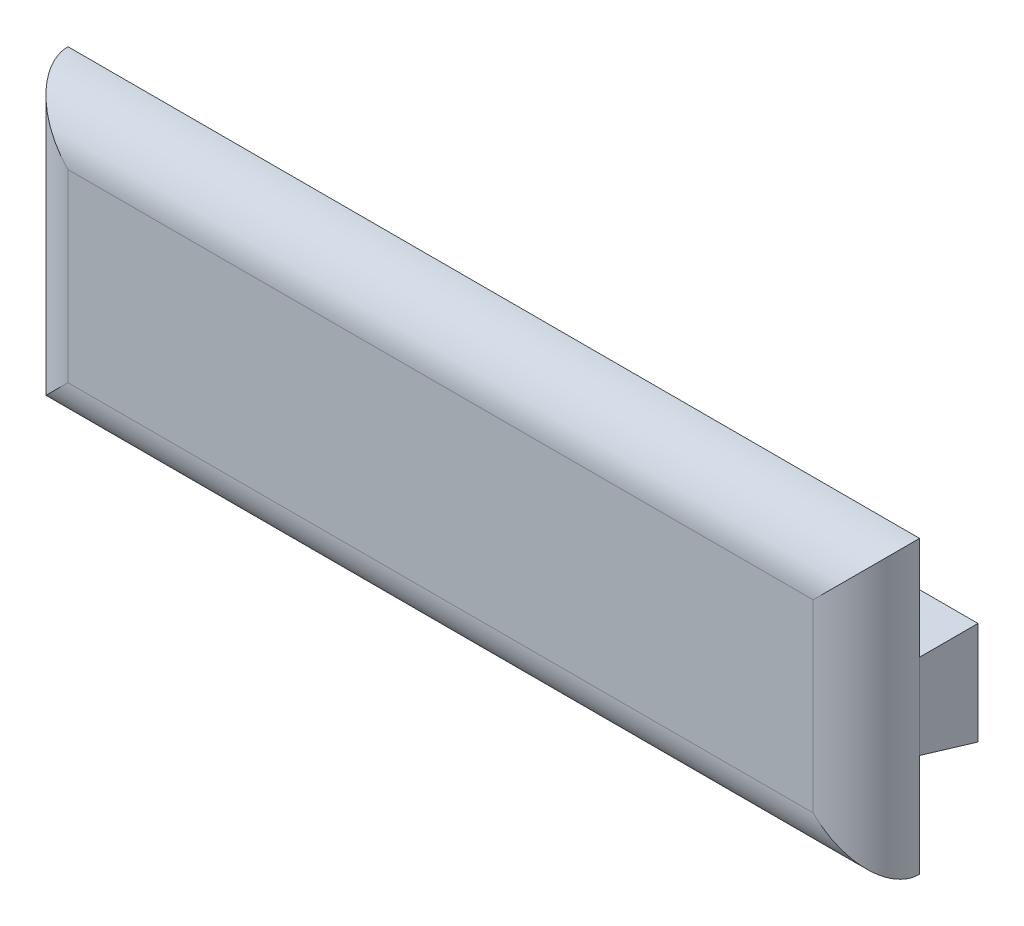
ISO-10303-21;
HEADER;
FILE_DESCRIPTION(('STEP AP214'),'2;1');
FILE_NAME('part.step','',(''),(''),'','','');
FILE_SCHEMA(('AUTOMOTIVE_DESIGN { 1 0 10303 214 1 1 1 1 }'));
ENDSEC;
DATA;
#1=APPLICATION_CONTEXT('core data for automotive mechanical design processes');
#2=APPLICATION_PROTOCOL_DEFINITION('international standard','automotive_design',2000,#1);
#3=PRODUCT_CONTEXT('',#1,'mechanical');
#4=PRODUCT('Part','Part','',(#3));
#5=PRODUCT_RELATED_PRODUCT_CATEGORY('part','',(#4));
#6=PRODUCT_DEFINITION_FORMATION('','',#4);
#7=PRODUCT_DEFINITION_CONTEXT('part definition',#1,'design');
#8=PRODUCT_DEFINITION('design','',#6,#7);
#9=PRODUCT_DEFINITION_SHAPE('','',#8);
#10=(LENGTH_UNIT() NAMED_UNIT(*) SI_UNIT(.MILLI.,.METRE.));
#11=(NAMED_UNIT(*) PLANE_ANGLE_UNIT() SI_UNIT($,.RADIAN.));
#12=(NAMED_UNIT(*) SI_UNIT($,.STERADIAN.) SOLID_ANGLE_UNIT());
#13=UNCERTAINTY_MEASURE_WITH_UNIT(LENGTH_MEASURE(1.E-05),#10,'distance_accuracy_value','');
#14=(GEOMETRIC_REPRESENTATION_CONTEXT(3) GLOBAL_UNCERTAINTY_ASSIGNED_CONTEXT((#13)) GLOBAL_UNIT_ASSIGNED_CONTEXT((#10,
#11,#12)) REPRESENTATION_CONTEXT('',''));
#15=CARTESIAN_POINT('',(0.,0.,0.));
#16=DIRECTION('',(0.,0.,1.));
#17=DIRECTION('',(1.,0.,0.));
#18=AXIS2_PLACEMENT_3D('',#15,#16,#17);
#19=CARTESIAN_POINT('',(0.,0.,0.));
#20=DIRECTION('',(0.,0.,-1.));
#21=DIRECTION('',(-1.,0.,0.));
#22=AXIS2_PLACEMENT_3D('',#19,#20,#21);
#23=PLANE('',#22);
#24=DIRECTION('',(1.,0.,0.));
#25=VECTOR('',#24,1.);
#26=CARTESIAN_POINT('',(12.,1.2,0.));
#27=LINE('',#26,#25);
#28=CARTESIAN_POINT('',(-12.,1.2,0.));
#29=VERTEX_POINT('',#28);
#30=CARTESIAN_POINT('',(12.,1.2,0.));
#31=VERTEX_POINT('',#30);
#32=EDGE_CURVE('E135',#29,#31,#27,.T.);
#33=ORIENTED_EDGE('',*,*,#32,.F.);
#34=DIRECTION('',(0.,-1.,0.));
#35=VECTOR('',#34,1.);
#36=CARTESIAN_POINT('',(-12.,-4.1,0.));
#37=LINE('',#36,#35);
#38=CARTESIAN_POINT('',(-12.,4.1,0.));
#39=VERTEX_POINT('',#38);
#40=EDGE_CURVE('E109',#39,#29,#37,.T.);
#41=ORIENTED_EDGE('',*,*,#40,.F.);
#42=DIRECTION('',(-1.,0.,0.));
#43=VECTOR('',#42,1.);
#44=CARTESIAN_POINT('',(-12.,4.1,0.));
#45=LINE('',#44,#43);
#46=CARTESIAN_POINT('',(12.,4.1,0.));
#47=VERTEX_POINT('',#46);
#48=EDGE_CURVE('E110',#47,#39,#45,.T.);
#49=ORIENTED_EDGE('',*,*,#48,.F.);
#50=DIRECTION('',(0.,1.,0.));
#51=VECTOR('',#50,1.);
#52=CARTESIAN_POINT('',(12.,-4.1,0.));
#53=LINE('',#52,#51);
#54=EDGE_CURVE('E146',#31,#47,#53,.T.);
#55=ORIENTED_EDGE('',*,*,#54,.F.);
#56=EDGE_LOOP('',(#33,#41,#49,#55));
#57=FACE_BOUND('',#56,.T.);
#58=ADVANCED_FACE('F35',(#57),#23,.T.);
#59=CARTESIAN_POINT('',(0.,0.,1.5));
#60=DIRECTION('',(0.,0.,-1.));
#61=DIRECTION('',(-1.,0.,0.));
#62=AXIS2_PLACEMENT_3D('',#59,#60,#61);
#63=PLANE('',#62);
#64=DIRECTION('',(0.,-1.,0.));
#65=VECTOR('',#64,1.);
#66=CARTESIAN_POINT('',(-10.5,0.,1.5));
#67=LINE('',#66,#65);
#68=CARTESIAN_POINT('',(-10.5,2.6,1.5));
#69=VERTEX_POINT('',#68);
#70=CARTESIAN_POINT('',(-10.5,-2.6,1.5));
#71=VERTEX_POINT('',#70);
#72=EDGE_CURVE('E44',#69,#71,#67,.T.);
#73=ORIENTED_EDGE('',*,*,#72,.T.);
#74=DIRECTION('',(1.,0.,0.));
#75=VECTOR('',#74,1.);
#76=CARTESIAN_POINT('',(0.,-2.6,1.5));
#77=LINE('',#76,#75);
#78=CARTESIAN_POINT('',(10.5,-2.6,1.5));
#79=VERTEX_POINT('',#78);
#80=EDGE_CURVE('E11',#71,#79,#77,.T.);
#81=ORIENTED_EDGE('',*,*,#80,.T.);
#82=DIRECTION('',(0.,1.,0.));
#83=VECTOR('',#82,1.);
#84=CARTESIAN_POINT('',(10.5,0.,1.5));
#85=LINE('',#84,#83);
#86=CARTESIAN_POINT('',(10.5,2.6,1.5));
#87=VERTEX_POINT('',#86);
#88=EDGE_CURVE('E176',#79,#87,#85,.T.);
#89=ORIENTED_EDGE('',*,*,#88,.T.);
#90=DIRECTION('',(-1.,0.,0.));
#91=VECTOR('',#90,1.);
#92=CARTESIAN_POINT('',(0.,2.6,1.5));
#93=LINE('',#92,#91);
#94=EDGE_CURVE('E55',#87,#69,#93,.T.);
#95=ORIENTED_EDGE('',*,*,#94,.T.);
#96=EDGE_LOOP('',(#73,#81,#89,#95));
#97=FACE_BOUND('',#96,.T.);
#98=ADVANCED_FACE('F212',(#97),#63,.F.);
#99=DIRECTION('',(-1.,0.,0.));
#100=VECTOR('',#99,1.);
#101=CARTESIAN_POINT('',(12.,-1.2,0.));
#102=LINE('',#101,#100);
#103=CARTESIAN_POINT('',(12.,-1.2,0.));
#104=VERTEX_POINT('',#103);
#105=CARTESIAN_POINT('',(-12.,-1.2,0.));
#106=VERTEX_POINT('',#105);
#107=EDGE_CURVE('E103',#104,#106,#102,.T.);
#108=ORIENTED_EDGE('',*,*,#107,.F.);
#109=CARTESIAN_POINT('',(12.,-4.1,0.));
#110=VERTEX_POINT('',#109);
#111=EDGE_CURVE('E173',#110,#104,#53,.T.);
#112=ORIENTED_EDGE('',*,*,#111,.F.);
#113=DIRECTION('',(1.,0.,0.));
#114=VECTOR('',#113,1.);
#115=CARTESIAN_POINT('',(-12.,-4.1,0.));
#116=LINE('',#115,#114);
#117=CARTESIAN_POINT('',(-12.,-4.1,0.));
#118=VERTEX_POINT('',#117);
#119=EDGE_CURVE('E106',#118,#110,#116,.T.);
#120=ORIENTED_EDGE('',*,*,#119,.F.);
#121=EDGE_CURVE('E100',#106,#118,#37,.T.);
#122=ORIENTED_EDGE('',*,*,#121,.F.);
#123=EDGE_LOOP('',(#108,#112,#120,#122));
#124=FACE_BOUND('',#123,.T.);
#125=ADVANCED_FACE('F102',(#124),#23,.T.);
#126=CARTESIAN_POINT('',(12.,1.2,0.));
#127=DIRECTION('',(0.984807753012208,0.,0.173648177666931));
#128=DIRECTION('',(0.173648177666931,0.,-0.984807753012208));
#129=AXIS2_PLACEMENT_3D('',#126,#127,#128);
#130=PLANE('',#129);
#131=DIRECTION('',(0.,-1.,0.));
#132=VECTOR('',#131,1.);
#133=CARTESIAN_POINT('',(12.,1.2,0.));
#134=LINE('',#133,#132);
#135=EDGE_CURVE('E122',#31,#104,#134,.T.);
#136=ORIENTED_EDGE('',*,*,#135,.T.);
#137=DIRECTION('',(-0.171087869746036,0.171087869746036,0.970287525247814));
#138=VECTOR('',#137,1.);
#139=CARTESIAN_POINT('',(12.,-1.2,0.));
#140=LINE('',#139,#138);
#141=CARTESIAN_POINT('',(12.2468577729919,-1.44685777299185,-1.4));
#142=VERTEX_POINT('',#141);
#143=EDGE_CURVE('E119',#142,#104,#140,.T.);
#144=ORIENTED_EDGE('',*,*,#143,.F.);
#145=DIRECTION('',(0.,1.,0.));
#146=VECTOR('',#145,1.);
#147=CARTESIAN_POINT('',(12.2468577729919,1.2,-1.4));
#148=LINE('',#147,#146);
#149=CARTESIAN_POINT('',(12.2468577729919,1.44685777299185,-1.4));
#150=VERTEX_POINT('',#149);
#151=EDGE_CURVE('E138',#150,#142,#148,.F.);
#152=ORIENTED_EDGE('',*,*,#151,.F.);
#153=DIRECTION('',(-0.171087869746036,-0.171087869746036,0.970287525247814));
#154=VECTOR('',#153,1.);
#155=CARTESIAN_POINT('',(12.,1.2,0.));
#156=LINE('',#155,#154);
#157=EDGE_CURVE('E153',#150,#31,#156,.T.);
#158=ORIENTED_EDGE('',*,*,#157,.T.);
#159=EDGE_LOOP('',(#136,#144,#152,#158));
#160=FACE_BOUND('',#159,.T.);
#161=ADVANCED_FACE('F208',(#160),#130,.T.);
#162=CARTESIAN_POINT('',(12.,-1.2,0.));
#163=DIRECTION('',(0.,-0.984807753012208,0.173648177666931));
#164=DIRECTION('',(0.,-0.173648177666931,-0.984807753012208));
#165=AXIS2_PLACEMENT_3D('',#162,#163,#164);
#166=PLANE('',#165);
#167=ORIENTED_EDGE('',*,*,#107,.T.);
#168=DIRECTION('',(0.171087869746036,0.171087869746036,0.970287525247814));
#169=VECTOR('',#168,1.);
#170=CARTESIAN_POINT('',(-11.9297494579818,-1.12974945798183,0.398410621765923));
#171=LINE('',#170,#169);
#172=CARTESIAN_POINT('',(-12.2468577729918,-1.44685777299185,-1.4));
#173=VERTEX_POINT('',#172);
#174=EDGE_CURVE('E116',#173,#106,#171,.T.);
#175=ORIENTED_EDGE('',*,*,#174,.F.);
#176=DIRECTION('',(1.,0.,0.));
#177=VECTOR('',#176,1.);
#178=CARTESIAN_POINT('',(12.,-1.44685777299185,-1.4));
#179=LINE('',#178,#177);
#180=EDGE_CURVE('E161',#142,#173,#179,.F.);
#181=ORIENTED_EDGE('',*,*,#180,.F.);
#182=ORIENTED_EDGE('',*,*,#143,.T.);
#183=EDGE_LOOP('',(#167,#175,#181,#182));
#184=FACE_BOUND('',#183,.T.);
#185=ADVANCED_FACE('F115',(#184),#166,.T.);
#186=CARTESIAN_POINT('',(-12.,1.2,0.));
#187=DIRECTION('',(-0.984807753012208,0.,0.173648177666931));
#188=DIRECTION('',(0.173648177666931,0.,0.984807753012208));
#189=AXIS2_PLACEMENT_3D('',#186,#187,#188);
#190=PLANE('',#189);
#191=DIRECTION('',(0.,1.,0.));
#192=VECTOR('',#191,1.);
#193=CARTESIAN_POINT('',(-12.,1.2,0.));
#194=LINE('',#193,#192);
#195=EDGE_CURVE('E121',#106,#29,#194,.T.);
#196=ORIENTED_EDGE('',*,*,#195,.T.);
#197=DIRECTION('',(0.171087869746036,-0.171087869746036,0.970287525247814));
#198=VECTOR('',#197,1.);
#199=CARTESIAN_POINT('',(-11.2974945798183,0.497494579818324,3.98410621765923));
#200=LINE('',#199,#198);
#201=CARTESIAN_POINT('',(-12.2468577729918,1.44685777299185,-1.4));
#202=VERTEX_POINT('',#201);
#203=EDGE_CURVE('E130',#202,#29,#200,.T.);
#204=ORIENTED_EDGE('',*,*,#203,.F.);
#205=DIRECTION('',(0.,-1.,0.));
#206=VECTOR('',#205,1.);
#207=CARTESIAN_POINT('',(-12.2468577729918,1.2,-1.4));
#208=LINE('',#207,#206);
#209=EDGE_CURVE('E129',#173,#202,#208,.F.);
#210=ORIENTED_EDGE('',*,*,#209,.F.);
#211=ORIENTED_EDGE('',*,*,#174,.T.);
#212=EDGE_LOOP('',(#196,#204,#210,#211));
#213=FACE_BOUND('',#212,.T.);
#214=ADVANCED_FACE('F126',(#213),#190,.T.);
#215=CARTESIAN_POINT('',(12.,1.2,0.));
#216=DIRECTION('',(0.,0.984807753012208,0.173648177666931));
#217=DIRECTION('',(0.,-0.173648177666931,0.984807753012208));
#218=AXIS2_PLACEMENT_3D('',#215,#216,#217);
#219=PLANE('',#218);
#220=ORIENTED_EDGE('',*,*,#32,.T.);
#221=ORIENTED_EDGE('',*,*,#157,.F.);
#222=DIRECTION('',(-1.,0.,0.));
#223=VECTOR('',#222,1.);
#224=CARTESIAN_POINT('',(12.,1.44685777299185,-1.4));
#225=LINE('',#224,#223);
#226=EDGE_CURVE('E164',#202,#150,#225,.F.);
#227=ORIENTED_EDGE('',*,*,#226,.F.);
#228=ORIENTED_EDGE('',*,*,#203,.T.);
#229=EDGE_LOOP('',(#220,#221,#227,#228));
#230=FACE_BOUND('',#229,.T.);
#231=ADVANCED_FACE('F203',(#230),#219,.T.);
#232=CARTESIAN_POINT('',(0.,0.,-1.4));
#233=DIRECTION('',(0.,0.,-1.));
#234=DIRECTION('',(-1.,0.,0.));
#235=AXIS2_PLACEMENT_3D('',#232,#233,#234);
#236=PLANE('',#235);
#237=ORIENTED_EDGE('',*,*,#151,.T.);
#238=ORIENTED_EDGE('',*,*,#180,.T.);
#239=ORIENTED_EDGE('',*,*,#209,.T.);
#240=ORIENTED_EDGE('',*,*,#226,.T.);
#241=EDGE_LOOP('',(#237,#238,#239,#240));
#242=FACE_BOUND('',#241,.T.);
#243=ADVANCED_FACE('F230',(#242),#236,.T.);
#244=CARTESIAN_POINT('',(0.,2.6,0.));
#245=DIRECTION('',(-1.,0.,0.));
#246=DIRECTION('',(0.,0.,1.));
#247=AXIS2_PLACEMENT_3D('',#244,#245,#246);
#248=CYLINDRICAL_SURFACE('',#247,1.5);
#249=CARTESIAN_POINT('',(10.5,2.6,0.));
#250=DIRECTION('',(-0.707106781186547,0.707106781186547,0.));
#251=DIRECTION('',(0.707106781186547,0.707106781186547,0.));
#252=AXIS2_PLACEMENT_3D('',#249,#250,#251);
#253=ELLIPSE('',#252,2.12132034355964,1.5);
#254=EDGE_CURVE('E192',#47,#87,#253,.F.);
#255=ORIENTED_EDGE('',*,*,#254,.F.);
#256=ORIENTED_EDGE('',*,*,#48,.T.);
#257=CARTESIAN_POINT('',(-10.5,2.6,0.));
#258=DIRECTION('',(-0.707106781186547,-0.707106781186547,0.));
#259=DIRECTION('',(-0.707106781186547,0.707106781186547,0.));
#260=AXIS2_PLACEMENT_3D('',#257,#258,#259);
#261=ELLIPSE('',#260,2.12132034355964,1.5);
#262=EDGE_CURVE('E39',#69,#39,#261,.T.);
#263=ORIENTED_EDGE('',*,*,#262,.F.);
#264=ORIENTED_EDGE('',*,*,#94,.F.);
#265=EDGE_LOOP('',(#255,#256,#263,#264));
#266=FACE_BOUND('',#265,.T.);
#267=ADVANCED_FACE('F37',(#266),#248,.T.);
#268=CARTESIAN_POINT('',(-10.5,0.,0.));
#269=DIRECTION('',(0.,-1.,0.));
#270=DIRECTION('',(0.,0.,-1.));
#271=AXIS2_PLACEMENT_3D('',#268,#269,#270);
#272=CYLINDRICAL_SURFACE('',#271,1.5);
#273=ORIENTED_EDGE('',*,*,#195,.F.);
#274=ORIENTED_EDGE('',*,*,#121,.T.);
#275=CARTESIAN_POINT('',(-10.5,-2.6,0.));
#276=DIRECTION('',(0.707106781186547,-0.707106781186547,0.));
#277=DIRECTION('',(-0.707106781186547,-0.707106781186547,0.));
#278=AXIS2_PLACEMENT_3D('',#275,#276,#277);
#279=ELLIPSE('',#278,2.12132034355964,1.5);
#280=EDGE_CURVE('E191',#71,#118,#279,.T.);
#281=ORIENTED_EDGE('',*,*,#280,.F.);
#282=ORIENTED_EDGE('',*,*,#72,.F.);
#283=ORIENTED_EDGE('',*,*,#262,.T.);
#284=ORIENTED_EDGE('',*,*,#40,.T.);
#285=EDGE_LOOP('',(#273,#274,#281,#282,#283,#284));
#286=FACE_BOUND('',#285,.T.);
#287=ADVANCED_FACE('F133',(#286),#272,.T.);
#288=CARTESIAN_POINT('',(10.5,0.,0.));
#289=DIRECTION('',(0.,1.,0.));
#290=DIRECTION('',(0.,0.,1.));
#291=AXIS2_PLACEMENT_3D('',#288,#289,#290);
#292=CYLINDRICAL_SURFACE('',#291,1.5);
#293=ORIENTED_EDGE('',*,*,#254,.T.);
#294=ORIENTED_EDGE('',*,*,#88,.F.);
#295=CARTESIAN_POINT('',(10.5,-2.6,0.));
#296=DIRECTION('',(0.707106781186547,0.707106781186547,0.));
#297=DIRECTION('',(-0.707106781186547,0.707106781186547,0.));
#298=AXIS2_PLACEMENT_3D('',#295,#296,#297);
#299=ELLIPSE('',#298,2.12132034355964,1.5);
#300=EDGE_CURVE('E189',#110,#79,#299,.F.);
#301=ORIENTED_EDGE('',*,*,#300,.F.);
#302=ORIENTED_EDGE('',*,*,#111,.T.);
#303=ORIENTED_EDGE('',*,*,#135,.F.);
#304=ORIENTED_EDGE('',*,*,#54,.T.);
#305=EDGE_LOOP('',(#293,#294,#301,#302,#303,#304));
#306=FACE_BOUND('',#305,.T.);
#307=ADVANCED_FACE('F209',(#306),#292,.T.);
#308=CARTESIAN_POINT('',(0.,-2.6,0.));
#309=DIRECTION('',(1.,0.,0.));
#310=DIRECTION('',(0.,0.,-1.));
#311=AXIS2_PLACEMENT_3D('',#308,#309,#310);
#312=CYLINDRICAL_SURFACE('',#311,1.5);
#313=ORIENTED_EDGE('',*,*,#280,.T.);
#314=ORIENTED_EDGE('',*,*,#119,.T.);
#315=ORIENTED_EDGE('',*,*,#300,.T.);
#316=ORIENTED_EDGE('',*,*,#80,.F.);
#317=EDGE_LOOP('',(#313,#314,#315,#316));
#318=FACE_BOUND('',#317,.T.);
#319=ADVANCED_FACE('F211',(#318),#312,.T.);
#320=CLOSED_SHELL('',(#58,#98,#125,#161,#185,#214,#231,#243,#267,#287,#307,#319));
#321=MANIFOLD_SOLID_BREP('B2',#320);
#322=ADVANCED_BREP_SHAPE_REPRESENTATION('',(#18,#321),#14);
#323=SHAPE_DEFINITION_REPRESENTATION(#9,#322);
ENDSEC;
END-ISO-10303-21;
